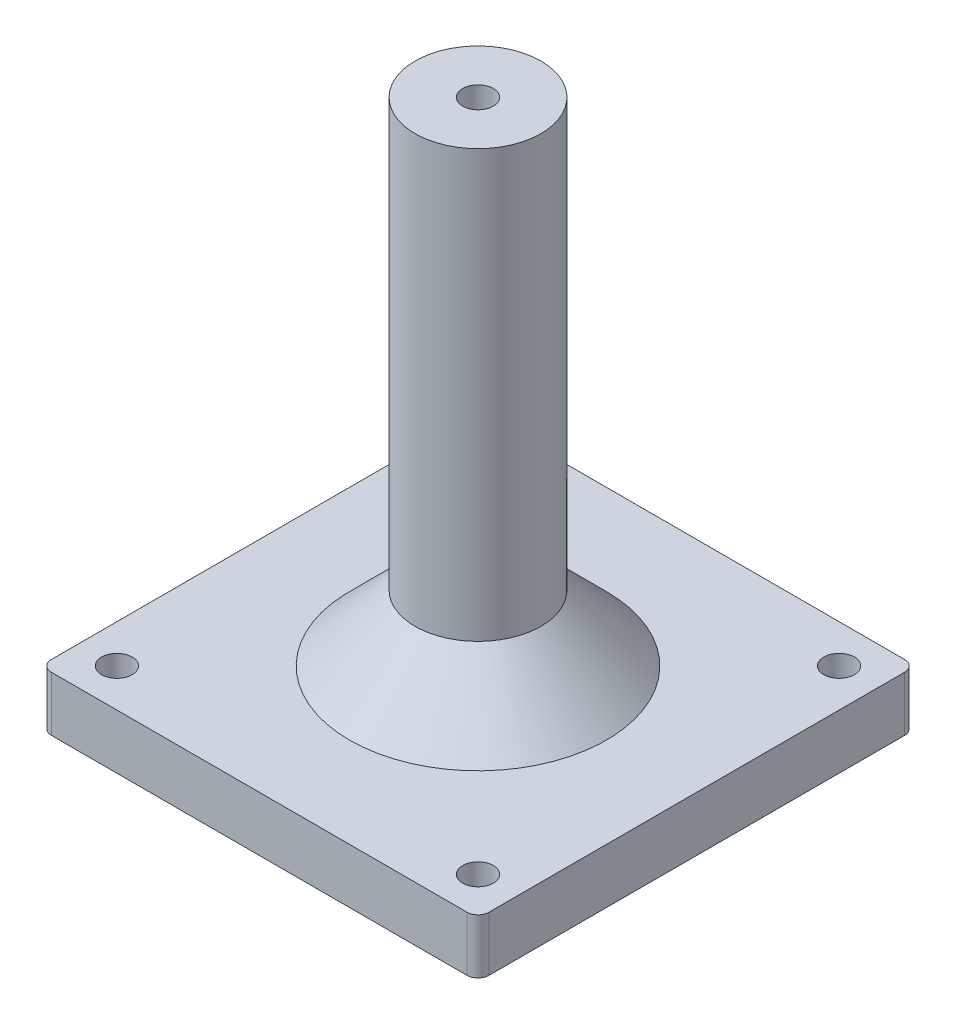
ISO-10303-21;
HEADER;
FILE_DESCRIPTION(('STEP AP214'),'2;1');
FILE_NAME('part.step','',(''),(''),'','','');
FILE_SCHEMA(('AUTOMOTIVE_DESIGN { 1 0 10303 214 1 1 1 1 }'));
ENDSEC;
DATA;
#1=APPLICATION_CONTEXT('core data for automotive mechanical design processes');
#2=APPLICATION_PROTOCOL_DEFINITION('international standard','automotive_design',2000,#1);
#3=PRODUCT_CONTEXT('',#1,'mechanical');
#4=PRODUCT('Part','Part','',(#3));
#5=PRODUCT_RELATED_PRODUCT_CATEGORY('part','',(#4));
#6=PRODUCT_DEFINITION_FORMATION('','',#4);
#7=PRODUCT_DEFINITION_CONTEXT('part definition',#1,'design');
#8=PRODUCT_DEFINITION('design','',#6,#7);
#9=PRODUCT_DEFINITION_SHAPE('','',#8);
#10=(LENGTH_UNIT() NAMED_UNIT(*) SI_UNIT(.MILLI.,.METRE.));
#11=(NAMED_UNIT(*) PLANE_ANGLE_UNIT() SI_UNIT($,.RADIAN.));
#12=(NAMED_UNIT(*) SI_UNIT($,.STERADIAN.) SOLID_ANGLE_UNIT());
#13=UNCERTAINTY_MEASURE_WITH_UNIT(LENGTH_MEASURE(1.E-05),#10,'distance_accuracy_value','');
#14=(GEOMETRIC_REPRESENTATION_CONTEXT(3) GLOBAL_UNCERTAINTY_ASSIGNED_CONTEXT((#13)) GLOBAL_UNIT_ASSIGNED_CONTEXT((#10,
#11,#12)) REPRESENTATION_CONTEXT('',''));
#15=CARTESIAN_POINT('',(0.,0.,0.));
#16=DIRECTION('',(0.,0.,1.));
#17=DIRECTION('',(1.,0.,0.));
#18=AXIS2_PLACEMENT_3D('',#15,#16,#17);
#19=CARTESIAN_POINT('',(20.,5.,-20.));
#20=DIRECTION('',(-1.,0.,0.));
#21=DIRECTION('',(0.,0.,1.));
#22=AXIS2_PLACEMENT_3D('',#19,#20,#21);
#23=PLANE('',#22);
#24=DIRECTION('',(0.,0.,-1.));
#25=VECTOR('',#24,1.);
#26=CARTESIAN_POINT('',(20.,0.,-20.));
#27=LINE('',#26,#25);
#28=CARTESIAN_POINT('',(20.,0.,19.));
#29=VERTEX_POINT('',#28);
#30=CARTESIAN_POINT('',(20.,0.,-19.));
#31=VERTEX_POINT('',#30);
#32=EDGE_CURVE('E149',#29,#31,#27,.T.);
#33=ORIENTED_EDGE('',*,*,#32,.T.);
#34=DIRECTION('',(0.,-1.,0.));
#35=VECTOR('',#34,1.);
#36=CARTESIAN_POINT('',(20.,5.,-19.));
#37=LINE('',#36,#35);
#38=CARTESIAN_POINT('',(20.,5.,-19.));
#39=VERTEX_POINT('',#38);
#40=EDGE_CURVE('E191',#31,#39,#37,.F.);
#41=ORIENTED_EDGE('',*,*,#40,.T.);
#42=DIRECTION('',(0.,0.,-1.));
#43=VECTOR('',#42,1.);
#44=CARTESIAN_POINT('',(20.,5.,-20.));
#45=LINE('',#44,#43);
#46=CARTESIAN_POINT('',(20.,5.,19.));
#47=VERTEX_POINT('',#46);
#48=EDGE_CURVE('E146',#47,#39,#45,.T.);
#49=ORIENTED_EDGE('',*,*,#48,.F.);
#50=DIRECTION('',(0.,-1.,0.));
#51=VECTOR('',#50,1.);
#52=CARTESIAN_POINT('',(20.,5.,19.));
#53=LINE('',#52,#51);
#54=EDGE_CURVE('E187',#47,#29,#53,.T.);
#55=ORIENTED_EDGE('',*,*,#54,.T.);
#56=EDGE_LOOP('',(#33,#41,#49,#55));
#57=FACE_BOUND('',#56,.T.);
#58=ADVANCED_FACE('F46',(#57),#23,.F.);
#59=CARTESIAN_POINT('',(-20.,5.,-20.));
#60=DIRECTION('',(0.,0.,1.));
#61=DIRECTION('',(1.,0.,0.));
#62=AXIS2_PLACEMENT_3D('',#59,#60,#61);
#63=PLANE('',#62);
#64=DIRECTION('',(-1.,0.,0.));
#65=VECTOR('',#64,1.);
#66=CARTESIAN_POINT('',(-20.,0.,-20.));
#67=LINE('',#66,#65);
#68=CARTESIAN_POINT('',(19.,0.,-20.));
#69=VERTEX_POINT('',#68);
#70=CARTESIAN_POINT('',(-19.,0.,-20.));
#71=VERTEX_POINT('',#70);
#72=EDGE_CURVE('E141',#69,#71,#67,.T.);
#73=ORIENTED_EDGE('',*,*,#72,.T.);
#74=DIRECTION('',(0.,-1.,0.));
#75=VECTOR('',#74,1.);
#76=CARTESIAN_POINT('',(-19.,5.,-20.));
#77=LINE('',#76,#75);
#78=CARTESIAN_POINT('',(-19.,5.,-20.));
#79=VERTEX_POINT('',#78);
#80=EDGE_CURVE('E117',#71,#79,#77,.F.);
#81=ORIENTED_EDGE('',*,*,#80,.T.);
#82=DIRECTION('',(-1.,0.,0.));
#83=VECTOR('',#82,1.);
#84=CARTESIAN_POINT('',(-20.,5.,-20.));
#85=LINE('',#84,#83);
#86=CARTESIAN_POINT('',(19.,5.,-20.));
#87=VERTEX_POINT('',#86);
#88=EDGE_CURVE('E208',#87,#79,#85,.T.);
#89=ORIENTED_EDGE('',*,*,#88,.F.);
#90=DIRECTION('',(0.,-1.,0.));
#91=VECTOR('',#90,1.);
#92=CARTESIAN_POINT('',(19.,5.,-20.));
#93=LINE('',#92,#91);
#94=EDGE_CURVE('E123',#87,#69,#93,.T.);
#95=ORIENTED_EDGE('',*,*,#94,.T.);
#96=EDGE_LOOP('',(#73,#81,#89,#95));
#97=FACE_BOUND('',#96,.T.);
#98=ADVANCED_FACE('F295',(#97),#63,.F.);
#99=CARTESIAN_POINT('',(-20.,5.,-20.));
#100=DIRECTION('',(1.,0.,0.));
#101=DIRECTION('',(0.,0.,-1.));
#102=AXIS2_PLACEMENT_3D('',#99,#100,#101);
#103=PLANE('',#102);
#104=DIRECTION('',(0.,0.,1.));
#105=VECTOR('',#104,1.);
#106=CARTESIAN_POINT('',(-20.,5.,-20.));
#107=LINE('',#106,#105);
#108=CARTESIAN_POINT('',(-20.,5.,-19.));
#109=VERTEX_POINT('',#108);
#110=CARTESIAN_POINT('',(-20.,5.,19.));
#111=VERTEX_POINT('',#110);
#112=EDGE_CURVE('E132',#109,#111,#107,.T.);
#113=ORIENTED_EDGE('',*,*,#112,.F.);
#114=DIRECTION('',(0.,-1.,0.));
#115=VECTOR('',#114,1.);
#116=CARTESIAN_POINT('',(-20.,5.,-19.));
#117=LINE('',#116,#115);
#118=CARTESIAN_POINT('',(-20.,0.,-19.));
#119=VERTEX_POINT('',#118);
#120=EDGE_CURVE('E116',#109,#119,#117,.T.);
#121=ORIENTED_EDGE('',*,*,#120,.T.);
#122=DIRECTION('',(0.,0.,1.));
#123=VECTOR('',#122,1.);
#124=CARTESIAN_POINT('',(-20.,0.,-20.));
#125=LINE('',#124,#123);
#126=CARTESIAN_POINT('',(-20.,0.,19.));
#127=VERTEX_POINT('',#126);
#128=EDGE_CURVE('E130',#119,#127,#125,.T.);
#129=ORIENTED_EDGE('',*,*,#128,.T.);
#130=DIRECTION('',(0.,-1.,0.));
#131=VECTOR('',#130,1.);
#132=CARTESIAN_POINT('',(-20.,5.,19.));
#133=LINE('',#132,#131);
#134=EDGE_CURVE('E135',#127,#111,#133,.F.);
#135=ORIENTED_EDGE('',*,*,#134,.T.);
#136=EDGE_LOOP('',(#113,#121,#129,#135));
#137=FACE_BOUND('',#136,.T.);
#138=ADVANCED_FACE('F129',(#137),#103,.F.);
#139=CARTESIAN_POINT('',(-20.,5.,20.));
#140=DIRECTION('',(0.,0.,-1.));
#141=DIRECTION('',(-1.,0.,0.));
#142=AXIS2_PLACEMENT_3D('',#139,#140,#141);
#143=PLANE('',#142);
#144=DIRECTION('',(1.,0.,0.));
#145=VECTOR('',#144,1.);
#146=CARTESIAN_POINT('',(-20.,0.,20.));
#147=LINE('',#146,#145);
#148=CARTESIAN_POINT('',(-19.,0.,20.));
#149=VERTEX_POINT('',#148);
#150=CARTESIAN_POINT('',(19.,0.,20.));
#151=VERTEX_POINT('',#150);
#152=EDGE_CURVE('E140',#149,#151,#147,.T.);
#153=ORIENTED_EDGE('',*,*,#152,.T.);
#154=DIRECTION('',(0.,-1.,0.));
#155=VECTOR('',#154,1.);
#156=CARTESIAN_POINT('',(19.,5.,20.));
#157=LINE('',#156,#155);
#158=CARTESIAN_POINT('',(19.,5.,20.));
#159=VERTEX_POINT('',#158);
#160=EDGE_CURVE('E11',#151,#159,#157,.F.);
#161=ORIENTED_EDGE('',*,*,#160,.T.);
#162=DIRECTION('',(1.,0.,0.));
#163=VECTOR('',#162,1.);
#164=CARTESIAN_POINT('',(-20.,5.,20.));
#165=LINE('',#164,#163);
#166=CARTESIAN_POINT('',(-19.,5.,20.));
#167=VERTEX_POINT('',#166);
#168=EDGE_CURVE('E158',#167,#159,#165,.T.);
#169=ORIENTED_EDGE('',*,*,#168,.F.);
#170=DIRECTION('',(0.,-1.,0.));
#171=VECTOR('',#170,1.);
#172=CARTESIAN_POINT('',(-19.,5.,20.));
#173=LINE('',#172,#171);
#174=EDGE_CURVE('E55',#167,#149,#173,.T.);
#175=ORIENTED_EDGE('',*,*,#174,.T.);
#176=EDGE_LOOP('',(#153,#161,#169,#175));
#177=FACE_BOUND('',#176,.T.);
#178=ADVANCED_FACE('F195',(#177),#143,.F.);
#179=CARTESIAN_POINT('',(0.,5.,0.));
#180=DIRECTION('',(0.,1.,0.));
#181=DIRECTION('',(0.,0.,1.));
#182=AXIS2_PLACEMENT_3D('',#179,#180,#181);
#183=PLANE('',#182);
#184=CARTESIAN_POINT('',(0.,5.,0.));
#185=DIRECTION('',(0.,1.,0.));
#186=DIRECTION('',(0.,0.,1.));
#187=AXIS2_PLACEMENT_3D('',#184,#185,#186);
#188=CIRCLE('',#187,11.75);
#189=CARTESIAN_POINT('',(0.,5.,11.75));
#190=VERTEX_POINT('',#189);
#191=EDGE_CURVE('E157',#190,#190,#188,.F.);
#192=ORIENTED_EDGE('',*,*,#191,.T.);
#193=EDGE_LOOP('',(#192));
#194=FACE_BOUND('',#193,.T.);
#195=CARTESIAN_POINT('',(16.5,5.,-16.5));
#196=DIRECTION('',(0.,1.,0.));
#197=DIRECTION('',(0.,0.,1.));
#198=AXIS2_PLACEMENT_3D('',#195,#196,#197);
#199=CIRCLE('',#198,1.4);
#200=CARTESIAN_POINT('',(16.5,5.,-15.1));
#201=VERTEX_POINT('',#200);
#202=EDGE_CURVE('E215',#201,#201,#199,.T.);
#203=ORIENTED_EDGE('',*,*,#202,.F.);
#204=EDGE_LOOP('',(#203));
#205=FACE_BOUND('',#204,.T.);
#206=CARTESIAN_POINT('',(16.5,5.,16.5));
#207=DIRECTION('',(0.,1.,0.));
#208=DIRECTION('',(0.,0.,1.));
#209=AXIS2_PLACEMENT_3D('',#206,#207,#208);
#210=CIRCLE('',#209,1.4);
#211=CARTESIAN_POINT('',(16.5,5.,17.9));
#212=VERTEX_POINT('',#211);
#213=EDGE_CURVE('E224',#212,#212,#210,.T.);
#214=ORIENTED_EDGE('',*,*,#213,.F.);
#215=EDGE_LOOP('',(#214));
#216=FACE_BOUND('',#215,.T.);
#217=CARTESIAN_POINT('',(-16.5,5.,16.5));
#218=DIRECTION('',(0.,1.,0.));
#219=DIRECTION('',(0.,0.,1.));
#220=AXIS2_PLACEMENT_3D('',#217,#218,#219);
#221=CIRCLE('',#220,1.4);
#222=CARTESIAN_POINT('',(-16.5,5.,17.9));
#223=VERTEX_POINT('',#222);
#224=EDGE_CURVE('E230',#223,#223,#221,.T.);
#225=ORIENTED_EDGE('',*,*,#224,.F.);
#226=EDGE_LOOP('',(#225));
#227=FACE_BOUND('',#226,.T.);
#228=CARTESIAN_POINT('',(-16.5,5.,-16.5));
#229=DIRECTION('',(0.,1.,0.));
#230=DIRECTION('',(0.,0.,1.));
#231=AXIS2_PLACEMENT_3D('',#228,#229,#230);
#232=CIRCLE('',#231,1.4);
#233=CARTESIAN_POINT('',(-16.5,5.,-15.1));
#234=VERTEX_POINT('',#233);
#235=EDGE_CURVE('E236',#234,#234,#232,.T.);
#236=ORIENTED_EDGE('',*,*,#235,.F.);
#237=EDGE_LOOP('',(#236));
#238=FACE_BOUND('',#237,.T.);
#239=ORIENTED_EDGE('',*,*,#88,.T.);
#240=CARTESIAN_POINT('',(-19.,5.,-19.));
#241=DIRECTION('',(0.,1.,0.));
#242=DIRECTION('',(0.,0.,1.));
#243=AXIS2_PLACEMENT_3D('',#240,#241,#242);
#244=CIRCLE('',#243,1.);
#245=EDGE_CURVE('E184',#79,#109,#244,.T.);
#246=ORIENTED_EDGE('',*,*,#245,.T.);
#247=ORIENTED_EDGE('',*,*,#112,.T.);
#248=CARTESIAN_POINT('',(-19.,5.,19.));
#249=DIRECTION('',(0.,1.,0.));
#250=DIRECTION('',(0.,0.,1.));
#251=AXIS2_PLACEMENT_3D('',#248,#249,#250);
#252=CIRCLE('',#251,1.);
#253=EDGE_CURVE('E67',#111,#167,#252,.T.);
#254=ORIENTED_EDGE('',*,*,#253,.T.);
#255=ORIENTED_EDGE('',*,*,#168,.T.);
#256=CARTESIAN_POINT('',(19.,5.,19.));
#257=DIRECTION('',(0.,1.,0.));
#258=DIRECTION('',(0.,0.,1.));
#259=AXIS2_PLACEMENT_3D('',#256,#257,#258);
#260=CIRCLE('',#259,1.);
#261=EDGE_CURVE('E178',#159,#47,#260,.T.);
#262=ORIENTED_EDGE('',*,*,#261,.T.);
#263=ORIENTED_EDGE('',*,*,#48,.T.);
#264=CARTESIAN_POINT('',(19.,5.,-19.));
#265=DIRECTION('',(0.,1.,0.));
#266=DIRECTION('',(0.,0.,1.));
#267=AXIS2_PLACEMENT_3D('',#264,#265,#266);
#268=CIRCLE('',#267,1.);
#269=EDGE_CURVE('E181',#39,#87,#268,.T.);
#270=ORIENTED_EDGE('',*,*,#269,.T.);
#271=EDGE_LOOP('',(#239,#246,#247,#254,#255,#262,#263,#270));
#272=FACE_BOUND('',#271,.T.);
#273=ADVANCED_FACE('F321',(#194,#205,#216,#227,#238,#272),#183,.T.);
#274=CARTESIAN_POINT('',(0.,0.,0.));
#275=DIRECTION('',(0.,1.,0.));
#276=DIRECTION('',(0.,0.,1.));
#277=AXIS2_PLACEMENT_3D('',#274,#275,#276);
#278=PLANE('',#277);
#279=CARTESIAN_POINT('',(16.5,0.,-16.5));
#280=DIRECTION('',(0.,-1.,0.));
#281=DIRECTION('',(0.,0.,-1.));
#282=AXIS2_PLACEMENT_3D('',#279,#280,#281);
#283=CIRCLE('',#282,1.4);
#284=CARTESIAN_POINT('',(16.5,0.,-17.9));
#285=VERTEX_POINT('',#284);
#286=EDGE_CURVE('E247',#285,#285,#283,.T.);
#287=ORIENTED_EDGE('',*,*,#286,.F.);
#288=EDGE_LOOP('',(#287));
#289=FACE_BOUND('',#288,.T.);
#290=CARTESIAN_POINT('',(16.5,0.,16.5));
#291=DIRECTION('',(0.,-1.,0.));
#292=DIRECTION('',(0.,0.,-1.));
#293=AXIS2_PLACEMENT_3D('',#290,#291,#292);
#294=CIRCLE('',#293,1.4);
#295=CARTESIAN_POINT('',(16.5,0.,15.1));
#296=VERTEX_POINT('',#295);
#297=EDGE_CURVE('E251',#296,#296,#294,.T.);
#298=ORIENTED_EDGE('',*,*,#297,.F.);
#299=EDGE_LOOP('',(#298));
#300=FACE_BOUND('',#299,.T.);
#301=CARTESIAN_POINT('',(-16.5,0.,16.5));
#302=DIRECTION('',(0.,-1.,0.));
#303=DIRECTION('',(0.,0.,-1.));
#304=AXIS2_PLACEMENT_3D('',#301,#302,#303);
#305=CIRCLE('',#304,1.4);
#306=CARTESIAN_POINT('',(-16.5,0.,15.1));
#307=VERTEX_POINT('',#306);
#308=EDGE_CURVE('E246',#307,#307,#305,.T.);
#309=ORIENTED_EDGE('',*,*,#308,.F.);
#310=EDGE_LOOP('',(#309));
#311=FACE_BOUND('',#310,.T.);
#312=CARTESIAN_POINT('',(-16.5,0.,-16.5));
#313=DIRECTION('',(0.,-1.,0.));
#314=DIRECTION('',(0.,0.,-1.));
#315=AXIS2_PLACEMENT_3D('',#312,#313,#314);
#316=CIRCLE('',#315,1.4);
#317=CARTESIAN_POINT('',(-16.5,0.,-17.9));
#318=VERTEX_POINT('',#317);
#319=EDGE_CURVE('E242',#318,#318,#316,.T.);
#320=ORIENTED_EDGE('',*,*,#319,.F.);
#321=EDGE_LOOP('',(#320));
#322=FACE_BOUND('',#321,.T.);
#323=ORIENTED_EDGE('',*,*,#128,.F.);
#324=CARTESIAN_POINT('',(-19.,0.,-19.));
#325=DIRECTION('',(0.,1.,0.));
#326=DIRECTION('',(0.,0.,1.));
#327=AXIS2_PLACEMENT_3D('',#324,#325,#326);
#328=CIRCLE('',#327,1.);
#329=EDGE_CURVE('E112',#119,#71,#328,.F.);
#330=ORIENTED_EDGE('',*,*,#329,.T.);
#331=ORIENTED_EDGE('',*,*,#72,.F.);
#332=CARTESIAN_POINT('',(19.,0.,-19.));
#333=DIRECTION('',(0.,1.,0.));
#334=DIRECTION('',(0.,0.,1.));
#335=AXIS2_PLACEMENT_3D('',#332,#333,#334);
#336=CIRCLE('',#335,1.);
#337=EDGE_CURVE('E124',#69,#31,#336,.F.);
#338=ORIENTED_EDGE('',*,*,#337,.T.);
#339=ORIENTED_EDGE('',*,*,#32,.F.);
#340=CARTESIAN_POINT('',(19.,0.,19.));
#341=DIRECTION('',(0.,1.,0.));
#342=DIRECTION('',(0.,0.,1.));
#343=AXIS2_PLACEMENT_3D('',#340,#341,#342);
#344=CIRCLE('',#343,1.);
#345=EDGE_CURVE('E166',#29,#151,#344,.F.);
#346=ORIENTED_EDGE('',*,*,#345,.T.);
#347=ORIENTED_EDGE('',*,*,#152,.F.);
#348=CARTESIAN_POINT('',(-19.,0.,19.));
#349=DIRECTION('',(0.,1.,0.));
#350=DIRECTION('',(0.,0.,1.));
#351=AXIS2_PLACEMENT_3D('',#348,#349,#350);
#352=CIRCLE('',#351,1.);
#353=EDGE_CURVE('E134',#149,#127,#352,.F.);
#354=ORIENTED_EDGE('',*,*,#353,.T.);
#355=EDGE_LOOP('',(#323,#330,#331,#338,#339,#346,#347,#354));
#356=FACE_BOUND('',#355,.T.);
#357=ADVANCED_FACE('F137',(#289,#300,#311,#322,#356),#278,.F.);
#358=CARTESIAN_POINT('',(-16.5,10.,-16.5));
#359=DIRECTION('',(0.,-1.,0.));
#360=DIRECTION('',(0.,0.,-1.));
#361=AXIS2_PLACEMENT_3D('',#358,#359,#360);
#362=CYLINDRICAL_SURFACE('',#361,1.4);
#363=ORIENTED_EDGE('',*,*,#235,.T.);
#364=EDGE_LOOP('',(#363));
#365=FACE_BOUND('',#364,.T.);
#366=ORIENTED_EDGE('',*,*,#319,.T.);
#367=EDGE_LOOP('',(#366));
#368=FACE_BOUND('',#367,.T.);
#369=ADVANCED_FACE('F331',(#365,#368),#362,.F.);
#370=CARTESIAN_POINT('',(-16.5,10.,16.5));
#371=DIRECTION('',(0.,-1.,0.));
#372=DIRECTION('',(0.,0.,-1.));
#373=AXIS2_PLACEMENT_3D('',#370,#371,#372);
#374=CYLINDRICAL_SURFACE('',#373,1.4);
#375=ORIENTED_EDGE('',*,*,#224,.T.);
#376=EDGE_LOOP('',(#375));
#377=FACE_BOUND('',#376,.T.);
#378=ORIENTED_EDGE('',*,*,#308,.T.);
#379=EDGE_LOOP('',(#378));
#380=FACE_BOUND('',#379,.T.);
#381=ADVANCED_FACE('F361',(#377,#380),#374,.F.);
#382=CARTESIAN_POINT('',(16.5,10.,16.5));
#383=DIRECTION('',(0.,-1.,0.));
#384=DIRECTION('',(0.,0.,-1.));
#385=AXIS2_PLACEMENT_3D('',#382,#383,#384);
#386=CYLINDRICAL_SURFACE('',#385,1.4);
#387=ORIENTED_EDGE('',*,*,#213,.T.);
#388=EDGE_LOOP('',(#387));
#389=FACE_BOUND('',#388,.T.);
#390=ORIENTED_EDGE('',*,*,#297,.T.);
#391=EDGE_LOOP('',(#390));
#392=FACE_BOUND('',#391,.T.);
#393=ADVANCED_FACE('F291',(#389,#392),#386,.F.);
#394=CARTESIAN_POINT('',(16.5,10.,-16.5));
#395=DIRECTION('',(0.,-1.,0.));
#396=DIRECTION('',(0.,0.,-1.));
#397=AXIS2_PLACEMENT_3D('',#394,#395,#396);
#398=CYLINDRICAL_SURFACE('',#397,1.4);
#399=ORIENTED_EDGE('',*,*,#202,.T.);
#400=EDGE_LOOP('',(#399));
#401=FACE_BOUND('',#400,.T.);
#402=ORIENTED_EDGE('',*,*,#286,.T.);
#403=EDGE_LOOP('',(#402));
#404=FACE_BOUND('',#403,.T.);
#405=ADVANCED_FACE('F285',(#401,#404),#398,.F.);
#406=CARTESIAN_POINT('',(0.,50.,0.));
#407=DIRECTION('',(0.,-1.,0.));
#408=DIRECTION('',(0.,0.,-1.));
#409=AXIS2_PLACEMENT_3D('',#406,#407,#408);
#410=CYLINDRICAL_SURFACE('',#409,5.75);
#411=CARTESIAN_POINT('',(0.,11.0000000000001,0.));
#412=DIRECTION('',(0.,1.,0.));
#413=DIRECTION('',(0.,0.,1.));
#414=AXIS2_PLACEMENT_3D('',#411,#412,#413);
#415=CIRCLE('',#414,5.75);
#416=CARTESIAN_POINT('',(0.,11.0000000000001,-5.75));
#417=VERTEX_POINT('',#416);
#418=EDGE_CURVE('E153',#417,#417,#415,.T.);
#419=CARTESIAN_POINT('',(0.,50.,0.));
#420=DIRECTION('',(0.,1.,0.));
#421=DIRECTION('',(0.,0.,1.));
#422=AXIS2_PLACEMENT_3D('',#419,#420,#421);
#423=CIRCLE('',#422,5.75);
#424=CARTESIAN_POINT('',(0.,50.,-5.75));
#425=VERTEX_POINT('',#424);
#426=EDGE_CURVE('E252',#425,#425,#423,.T.);
#427=CARTESIAN_POINT('',(0.,11.0000000000001,-5.75));
#428=CARTESIAN_POINT('',(0.,11.4062500000001,-5.75));
#429=CARTESIAN_POINT('',(0.,11.8125000000001,-5.75));
#430=CARTESIAN_POINT('',(0.,12.6250000000001,-5.75));
#431=CARTESIAN_POINT('',(0.,13.0312500000001,-5.75));
#432=CARTESIAN_POINT('',(0.,13.8437500000001,-5.75));
#433=CARTESIAN_POINT('',(0.,14.2500000000001,-5.75));
#434=CARTESIAN_POINT('',(0.,15.0625000000001,-5.75));
#435=CARTESIAN_POINT('',(0.,15.4687500000001,-5.75));
#436=CARTESIAN_POINT('',(0.,16.2812500000001,-5.75));
#437=CARTESIAN_POINT('',(0.,16.6875000000001,-5.75));
#438=CARTESIAN_POINT('',(0.,17.5000000000001,-5.75));
#439=CARTESIAN_POINT('',(0.,17.9062500000001,-5.75));
#440=CARTESIAN_POINT('',(0.,18.7187500000001,-5.75));
#441=CARTESIAN_POINT('',(0.,19.1250000000001,-5.75));
#442=CARTESIAN_POINT('',(0.,19.9375000000001,-5.75));
#443=CARTESIAN_POINT('',(0.,20.3437500000001,-5.75));
#444=CARTESIAN_POINT('',(0.,21.1562500000001,-5.75));
#445=CARTESIAN_POINT('',(0.,21.5625000000001,-5.75));
#446=CARTESIAN_POINT('',(0.,22.3750000000001,-5.75));
#447=CARTESIAN_POINT('',(0.,22.7812500000001,-5.75));
#448=CARTESIAN_POINT('',(0.,23.5937500000001,-5.75));
#449=CARTESIAN_POINT('',(0.,24.0000000000001,-5.75));
#450=CARTESIAN_POINT('',(0.,24.8125000000001,-5.75));
#451=CARTESIAN_POINT('',(0.,25.2187500000001,-5.75));
#452=CARTESIAN_POINT('',(0.,26.0312500000001,-5.75));
#453=CARTESIAN_POINT('',(0.,26.4375,-5.75));
#454=CARTESIAN_POINT('',(0.,27.2500000000001,-5.75));
#455=CARTESIAN_POINT('',(0.,27.65625,-5.75));
#456=CARTESIAN_POINT('',(0.,28.46875,-5.75));
#457=CARTESIAN_POINT('',(0.,28.875,-5.75));
#458=CARTESIAN_POINT('',(0.,29.6875,-5.75));
#459=CARTESIAN_POINT('',(0.,30.09375,-5.75));
#460=CARTESIAN_POINT('',(0.,30.90625,-5.75));
#461=CARTESIAN_POINT('',(0.,31.3125,-5.75));
#462=CARTESIAN_POINT('',(0.,32.125,-5.75));
#463=CARTESIAN_POINT('',(0.,32.53125,-5.75));
#464=CARTESIAN_POINT('',(0.,33.34375,-5.75));
#465=CARTESIAN_POINT('',(0.,33.75,-5.75));
#466=CARTESIAN_POINT('',(0.,34.5625,-5.75));
#467=CARTESIAN_POINT('',(0.,34.96875,-5.75));
#468=CARTESIAN_POINT('',(0.,35.78125,-5.75));
#469=CARTESIAN_POINT('',(0.,36.1875,-5.75));
#470=CARTESIAN_POINT('',(0.,37.,-5.75));
#471=CARTESIAN_POINT('',(0.,37.40625,-5.75));
#472=CARTESIAN_POINT('',(0.,38.21875,-5.75));
#473=CARTESIAN_POINT('',(0.,38.625,-5.75));
#474=CARTESIAN_POINT('',(0.,39.4375,-5.75));
#475=CARTESIAN_POINT('',(0.,39.84375,-5.75));
#476=CARTESIAN_POINT('',(0.,40.65625,-5.75));
#477=CARTESIAN_POINT('',(0.,41.0625,-5.75));
#478=CARTESIAN_POINT('',(0.,41.875,-5.75));
#479=CARTESIAN_POINT('',(0.,42.28125,-5.75));
#480=CARTESIAN_POINT('',(0.,43.09375,-5.75));
#481=CARTESIAN_POINT('',(0.,43.5,-5.75));
#482=CARTESIAN_POINT('',(0.,44.3125,-5.75));
#483=CARTESIAN_POINT('',(0.,44.71875,-5.75));
#484=CARTESIAN_POINT('',(0.,45.53125,-5.75));
#485=CARTESIAN_POINT('',(0.,45.9375,-5.75));
#486=CARTESIAN_POINT('',(0.,46.75,-5.75));
#487=CARTESIAN_POINT('',(0.,47.15625,-5.75));
#488=CARTESIAN_POINT('',(0.,47.96875,-5.75));
#489=CARTESIAN_POINT('',(0.,48.375,-5.75));
#490=CARTESIAN_POINT('',(0.,49.1875,-5.75));
#491=CARTESIAN_POINT('',(0.,49.59375,-5.75));
#492=CARTESIAN_POINT('',(0.,50.,-5.75));
#493=B_SPLINE_CURVE_WITH_KNOTS('',3,(#427,#428,#429,#430,#431,#432,#433,#434,#435,#436,#437,
#438,#439,#440,#441,#442,#443,#444,#445,#446,#447,#448,#449,#450,#451,#452,#453,#454,#455,#456,
#457,#458,#459,#460,#461,#462,#463,#464,#465,#466,#467,#468,#469,#470,#471,#472,#473,#474,#475,
#476,#477,#478,#479,#480,#481,#482,#483,#484,#485,#486,#487,#488,#489,#490,#491,#492),
.UNSPECIFIED.,.F.,.F.,(4,2,2,2,2,2,2,2,2,2,2,2,2,2,2,2,2,2,2,2,2,2,2,2,2,2,2,2,2,2,2,2,4),(0.,
1.21875,2.4375,3.65624999999999,4.87499999999999,6.09374999999999,7.31249999999999,
8.53124999999998,9.74999999999997,10.96875,12.1875,13.40625,14.625,15.84375,17.0625,18.28125,
19.5,20.71875,21.9374999999999,23.1562499999999,24.3749999999999,25.5937499999999,
26.8124999999999,28.0312499999999,29.2499999999999,30.4687499999999,31.6874999999999,
32.9062499999999,34.1249999999999,35.3437499999999,36.5624999999999,37.7812499999999,
38.9999999999999),.UNSPECIFIED.);
#494=EDGE_CURVE('BSEAM280',#417,#425,#493,.T.);
#495=ORIENTED_EDGE('',*,*,#418,.T.);
#496=ORIENTED_EDGE('',*,*,#426,.F.);
#497=ORIENTED_EDGE('',*,*,#494,.T.);
#498=ORIENTED_EDGE('',*,*,#494,.F.);
#499=EDGE_LOOP('',(#495,#497,#496,#498));
#500=FACE_BOUND('',#499,.T.);
#501=ADVANCED_FACE('F280',(#500),#410,.T.);
#502=CARTESIAN_POINT('',(0.,50.,0.));
#503=DIRECTION('',(0.,1.,0.));
#504=DIRECTION('',(0.,0.,1.));
#505=AXIS2_PLACEMENT_3D('',#502,#503,#504);
#506=PLANE('',#505);
#507=CARTESIAN_POINT('',(0.,50.,0.));
#508=DIRECTION('',(0.,1.,0.));
#509=DIRECTION('',(0.,0.,1.));
#510=AXIS2_PLACEMENT_3D('',#507,#508,#509);
#511=CIRCLE('',#510,1.4);
#512=CARTESIAN_POINT('',(0.,50.,1.4));
#513=VERTEX_POINT('',#512);
#514=EDGE_CURVE('E262',#513,#513,#511,.T.);
#515=ORIENTED_EDGE('',*,*,#514,.F.);
#516=EDGE_LOOP('',(#515));
#517=FACE_BOUND('',#516,.T.);
#518=ORIENTED_EDGE('',*,*,#426,.T.);
#519=EDGE_LOOP('',(#518));
#520=FACE_BOUND('',#519,.T.);
#521=ADVANCED_FACE('F277',(#517,#520),#506,.T.);
#522=CARTESIAN_POINT('',(0.,11.0000000000001,0.));
#523=DIRECTION('',(0.,-1.,0.));
#524=DIRECTION('',(0.,0.,-1.));
#525=AXIS2_PLACEMENT_3D('',#522,#523,#524);
#526=CONICAL_SURFACE('',#525,5.75,0.785398163397443);
#527=ORIENTED_EDGE('',*,*,#191,.F.);
#528=EDGE_LOOP('',(#527));
#529=FACE_BOUND('',#528,.T.);
#530=ORIENTED_EDGE('',*,*,#418,.F.);
#531=EDGE_LOOP('',(#530));
#532=FACE_BOUND('',#531,.T.);
#533=ADVANCED_FACE('F273',(#529,#532),#526,.T.);
#534=CARTESIAN_POINT('',(0.,34.,0.));
#535=DIRECTION('',(0.,1.,0.));
#536=DIRECTION('',(0.,0.,1.));
#537=AXIS2_PLACEMENT_3D('',#534,#535,#536);
#538=CYLINDRICAL_SURFACE('',#537,1.4);
#539=CARTESIAN_POINT('',(0.,34.,0.));
#540=DIRECTION('',(0.,1.,0.));
#541=DIRECTION('',(0.,0.,1.));
#542=AXIS2_PLACEMENT_3D('',#539,#540,#541);
#543=CIRCLE('',#542,1.4);
#544=CARTESIAN_POINT('',(0.,34.,1.4));
#545=VERTEX_POINT('',#544);
#546=EDGE_CURVE('E261',#545,#545,#543,.T.);
#547=ORIENTED_EDGE('',*,*,#546,.F.);
#548=EDGE_LOOP('',(#547));
#549=FACE_BOUND('',#548,.T.);
#550=ORIENTED_EDGE('',*,*,#514,.T.);
#551=EDGE_LOOP('',(#550));
#552=FACE_BOUND('',#551,.T.);
#553=ADVANCED_FACE('F270',(#549,#552),#538,.F.);
#554=CARTESIAN_POINT('',(0.,34.,0.));
#555=DIRECTION('',(0.,1.,0.));
#556=DIRECTION('',(0.,0.,1.));
#557=AXIS2_PLACEMENT_3D('',#554,#555,#556);
#558=PLANE('',#557);
#559=ORIENTED_EDGE('',*,*,#546,.T.);
#560=EDGE_LOOP('',(#559));
#561=FACE_BOUND('',#560,.T.);
#562=ADVANCED_FACE('F268',(#561),#558,.T.);
#563=CARTESIAN_POINT('',(-19.,5.,-19.));
#564=DIRECTION('',(0.,-1.,0.));
#565=DIRECTION('',(0.,0.,-1.));
#566=AXIS2_PLACEMENT_3D('',#563,#564,#565);
#567=CYLINDRICAL_SURFACE('',#566,1.);
#568=ORIENTED_EDGE('',*,*,#245,.F.);
#569=ORIENTED_EDGE('',*,*,#80,.F.);
#570=ORIENTED_EDGE('',*,*,#329,.F.);
#571=ORIENTED_EDGE('',*,*,#120,.F.);
#572=EDGE_LOOP('',(#568,#569,#570,#571));
#573=FACE_BOUND('',#572,.T.);
#574=ADVANCED_FACE('F115',(#573),#567,.T.);
#575=CARTESIAN_POINT('',(19.,5.,-19.));
#576=DIRECTION('',(0.,-1.,0.));
#577=DIRECTION('',(0.,0.,-1.));
#578=AXIS2_PLACEMENT_3D('',#575,#576,#577);
#579=CYLINDRICAL_SURFACE('',#578,1.);
#580=ORIENTED_EDGE('',*,*,#269,.F.);
#581=ORIENTED_EDGE('',*,*,#40,.F.);
#582=ORIENTED_EDGE('',*,*,#337,.F.);
#583=ORIENTED_EDGE('',*,*,#94,.F.);
#584=EDGE_LOOP('',(#580,#581,#582,#583));
#585=FACE_BOUND('',#584,.T.);
#586=ADVANCED_FACE('F312',(#585),#579,.T.);
#587=CARTESIAN_POINT('',(19.,5.,19.));
#588=DIRECTION('',(0.,-1.,0.));
#589=DIRECTION('',(0.,0.,-1.));
#590=AXIS2_PLACEMENT_3D('',#587,#588,#589);
#591=CYLINDRICAL_SURFACE('',#590,1.);
#592=ORIENTED_EDGE('',*,*,#261,.F.);
#593=ORIENTED_EDGE('',*,*,#160,.F.);
#594=ORIENTED_EDGE('',*,*,#345,.F.);
#595=ORIENTED_EDGE('',*,*,#54,.F.);
#596=EDGE_LOOP('',(#592,#593,#594,#595));
#597=FACE_BOUND('',#596,.T.);
#598=ADVANCED_FACE('F202',(#597),#591,.T.);
#599=CARTESIAN_POINT('',(-19.,5.,19.));
#600=DIRECTION('',(0.,-1.,0.));
#601=DIRECTION('',(0.,0.,-1.));
#602=AXIS2_PLACEMENT_3D('',#599,#600,#601);
#603=CYLINDRICAL_SURFACE('',#602,1.);
#604=ORIENTED_EDGE('',*,*,#253,.F.);
#605=ORIENTED_EDGE('',*,*,#134,.F.);
#606=ORIENTED_EDGE('',*,*,#353,.F.);
#607=ORIENTED_EDGE('',*,*,#174,.F.);
#608=EDGE_LOOP('',(#604,#605,#606,#607));
#609=FACE_BOUND('',#608,.T.);
#610=ADVANCED_FACE('F48',(#609),#603,.T.);
#611=CLOSED_SHELL('',(#58,#98,#138,#178,#273,#357,#369,#381,#393,#405,#501,#521,#533,#553,#562,
#574,#586,#598,#610));
#612=MANIFOLD_SOLID_BREP('B2',#611);
#613=ADVANCED_BREP_SHAPE_REPRESENTATION('',(#18,#612),#14);
#614=SHAPE_DEFINITION_REPRESENTATION(#9,#613);
ENDSEC;
END-ISO-10303-21;
